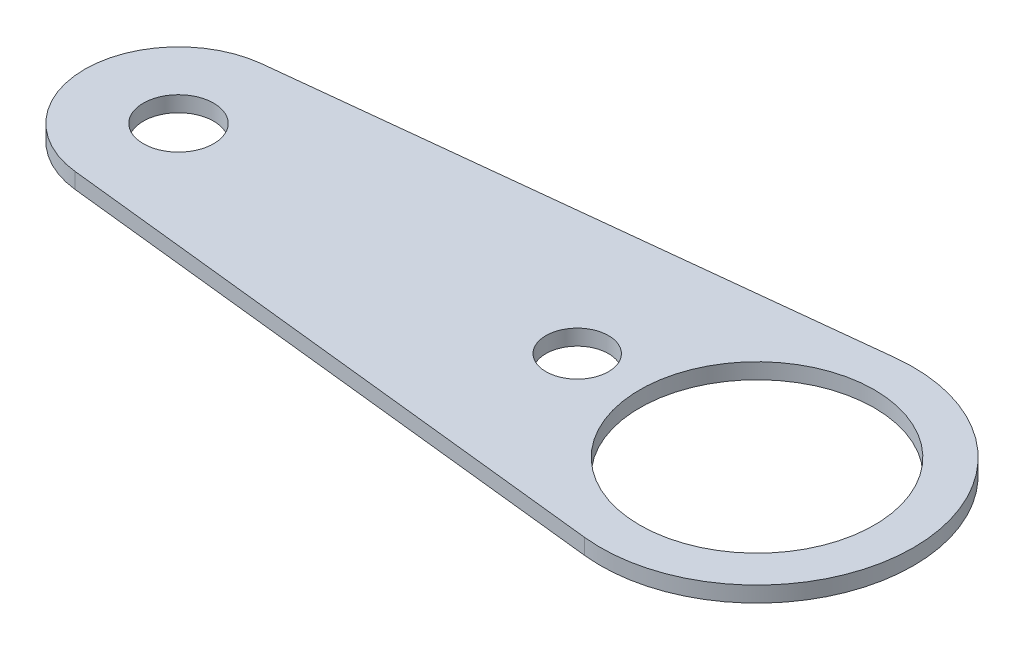
ISO-10303-21;
HEADER;
FILE_DESCRIPTION(('STEP AP214'),'2;1');
FILE_NAME('part.step','',(''),(''),'','','');
FILE_SCHEMA(('AUTOMOTIVE_DESIGN { 1 0 10303 214 1 1 1 1 }'));
ENDSEC;
DATA;
#1=APPLICATION_CONTEXT('core data for automotive mechanical design processes');
#2=APPLICATION_PROTOCOL_DEFINITION('international standard','automotive_design',2000,#1);
#3=PRODUCT_CONTEXT('',#1,'mechanical');
#4=PRODUCT('Part','Part','',(#3));
#5=PRODUCT_RELATED_PRODUCT_CATEGORY('part','',(#4));
#6=PRODUCT_DEFINITION_FORMATION('','',#4);
#7=PRODUCT_DEFINITION_CONTEXT('part definition',#1,'design');
#8=PRODUCT_DEFINITION('design','',#6,#7);
#9=PRODUCT_DEFINITION_SHAPE('','',#8);
#10=(LENGTH_UNIT() NAMED_UNIT(*) SI_UNIT(.MILLI.,.METRE.));
#11=(NAMED_UNIT(*) PLANE_ANGLE_UNIT() SI_UNIT($,.RADIAN.));
#12=(NAMED_UNIT(*) SI_UNIT($,.STERADIAN.) SOLID_ANGLE_UNIT());
#13=UNCERTAINTY_MEASURE_WITH_UNIT(LENGTH_MEASURE(1.E-05),#10,'distance_accuracy_value','');
#14=(GEOMETRIC_REPRESENTATION_CONTEXT(3) GLOBAL_UNCERTAINTY_ASSIGNED_CONTEXT((#13)) GLOBAL_UNIT_ASSIGNED_CONTEXT((#10,
#11,#12)) REPRESENTATION_CONTEXT('',''));
#15=CARTESIAN_POINT('',(0.,0.,0.));
#16=DIRECTION('',(0.,0.,1.));
#17=DIRECTION('',(1.,0.,0.));
#18=AXIS2_PLACEMENT_3D('',#15,#16,#17);
#19=CARTESIAN_POINT('',(0.,1.,0.));
#20=DIRECTION('',(0.,1.,0.));
#21=DIRECTION('',(0.,0.,1.));
#22=AXIS2_PLACEMENT_3D('',#19,#20,#21);
#23=PLANE('',#22);
#24=CARTESIAN_POINT('',(0.,1.,0.));
#25=DIRECTION('',(0.,1.,0.));
#26=DIRECTION('',(0.,0.,1.));
#27=AXIS2_PLACEMENT_3D('',#24,#25,#26);
#28=CIRCLE('',#27,7.5);
#29=CARTESIAN_POINT('',(0.,1.,7.5));
#30=VERTEX_POINT('',#29);
#31=EDGE_CURVE('E114',#30,#30,#28,.T.);
#32=ORIENTED_EDGE('',*,*,#31,.F.);
#33=EDGE_LOOP('',(#32));
#34=FACE_BOUND('',#33,.T.);
#35=CARTESIAN_POINT('',(0.,1.,0.));
#36=DIRECTION('',(0.,1.,0.));
#37=DIRECTION('',(0.,0.,1.));
#38=AXIS2_PLACEMENT_3D('',#35,#36,#37);
#39=CIRCLE('',#38,10.);
#40=CARTESIAN_POINT('',(-1.08108108108108,1.,9.94139143662136));
#41=VERTEX_POINT('',#40);
#42=CARTESIAN_POINT('',(-1.08108108108108,1.,-9.94139143662136));
#43=VERTEX_POINT('',#42);
#44=EDGE_CURVE('E84',#41,#43,#39,.T.);
#45=ORIENTED_EDGE('',*,*,#44,.T.);
#46=DIRECTION('',(-0.994139143662136,0.,0.108108108108108));
#47=VECTOR('',#46,1.);
#48=CARTESIAN_POINT('',(-1.08108108108108,1.,-9.94139143662136));
#49=LINE('',#48,#47);
#50=CARTESIAN_POINT('',(-37.6486486486486,1.,-5.96483486197282));
#51=VERTEX_POINT('',#50);
#52=EDGE_CURVE('E79',#43,#51,#49,.T.);
#53=ORIENTED_EDGE('',*,*,#52,.T.);
#54=CARTESIAN_POINT('',(-37.,1.,0.));
#55=DIRECTION('',(0.,1.,0.));
#56=DIRECTION('',(0.,0.,1.));
#57=AXIS2_PLACEMENT_3D('',#54,#55,#56);
#58=CIRCLE('',#57,6.);
#59=CARTESIAN_POINT('',(-37.6486486486486,1.,5.96483486197282));
#60=VERTEX_POINT('',#59);
#61=EDGE_CURVE('E82',#51,#60,#58,.T.);
#62=ORIENTED_EDGE('',*,*,#61,.T.);
#63=DIRECTION('',(0.994139143662136,0.,0.108108108108108));
#64=VECTOR('',#63,1.);
#65=CARTESIAN_POINT('',(-1.08108108108108,1.,9.94139143662136));
#66=LINE('',#65,#64);
#67=EDGE_CURVE('E49',#60,#41,#66,.T.);
#68=ORIENTED_EDGE('',*,*,#67,.T.);
#69=EDGE_LOOP('',(#45,#53,#62,#68));
#70=FACE_BOUND('',#69,.T.);
#71=CARTESIAN_POINT('',(-37.,1.,0.));
#72=DIRECTION('',(0.,1.,0.));
#73=DIRECTION('',(0.,0.,1.));
#74=AXIS2_PLACEMENT_3D('',#71,#72,#73);
#75=CIRCLE('',#74,2.25);
#76=CARTESIAN_POINT('',(-37.,1.,2.25));
#77=VERTEX_POINT('',#76);
#78=EDGE_CURVE('E99',#77,#77,#75,.T.);
#79=ORIENTED_EDGE('',*,*,#78,.F.);
#80=EDGE_LOOP('',(#79));
#81=FACE_BOUND('',#80,.T.);
#82=CARTESIAN_POINT('',(-11.5,1.,0.));
#83=DIRECTION('',(0.,1.,0.));
#84=DIRECTION('',(0.,0.,1.));
#85=AXIS2_PLACEMENT_3D('',#82,#83,#84);
#86=CIRCLE('',#85,2.);
#87=CARTESIAN_POINT('',(-11.5,1.,2.));
#88=VERTEX_POINT('',#87);
#89=EDGE_CURVE('E120',#88,#88,#86,.T.);
#90=ORIENTED_EDGE('',*,*,#89,.F.);
#91=EDGE_LOOP('',(#90));
#92=FACE_BOUND('',#91,.T.);
#93=ADVANCED_FACE('F32',(#34,#70,#81,#92),#23,.T.);
#94=CARTESIAN_POINT('',(0.,0.,0.));
#95=DIRECTION('',(0.,1.,0.));
#96=DIRECTION('',(0.,0.,1.));
#97=AXIS2_PLACEMENT_3D('',#94,#95,#96);
#98=PLANE('',#97);
#99=CARTESIAN_POINT('',(0.,0.,0.));
#100=DIRECTION('',(0.,1.,0.));
#101=DIRECTION('',(0.,0.,1.));
#102=AXIS2_PLACEMENT_3D('',#99,#100,#101);
#103=CIRCLE('',#102,10.);
#104=CARTESIAN_POINT('',(-1.08108108108108,0.,9.94139143662136));
#105=VERTEX_POINT('',#104);
#106=CARTESIAN_POINT('',(-1.08108108108108,0.,-9.94139143662136));
#107=VERTEX_POINT('',#106);
#108=EDGE_CURVE('E96',#105,#107,#103,.T.);
#109=ORIENTED_EDGE('',*,*,#108,.F.);
#110=DIRECTION('',(0.994139143662136,0.,0.108108108108108));
#111=VECTOR('',#110,1.);
#112=CARTESIAN_POINT('',(-1.08108108108108,0.,9.94139143662136));
#113=LINE('',#112,#111);
#114=CARTESIAN_POINT('',(-37.6486486486486,0.,5.96483486197282));
#115=VERTEX_POINT('',#114);
#116=EDGE_CURVE('E72',#115,#105,#113,.T.);
#117=ORIENTED_EDGE('',*,*,#116,.F.);
#118=CARTESIAN_POINT('',(-37.,0.,0.));
#119=DIRECTION('',(0.,1.,0.));
#120=DIRECTION('',(0.,0.,1.));
#121=AXIS2_PLACEMENT_3D('',#118,#119,#120);
#122=CIRCLE('',#121,6.);
#123=CARTESIAN_POINT('',(-37.6486486486486,0.,-5.96483486197282));
#124=VERTEX_POINT('',#123);
#125=EDGE_CURVE('E66',#124,#115,#122,.T.);
#126=ORIENTED_EDGE('',*,*,#125,.F.);
#127=DIRECTION('',(-0.994139143662136,0.,0.108108108108108));
#128=VECTOR('',#127,1.);
#129=CARTESIAN_POINT('',(-1.08108108108108,0.,-9.94139143662136));
#130=LINE('',#129,#128);
#131=EDGE_CURVE('E88',#107,#124,#130,.T.);
#132=ORIENTED_EDGE('',*,*,#131,.F.);
#133=EDGE_LOOP('',(#109,#117,#126,#132));
#134=FACE_BOUND('',#133,.T.);
#135=CARTESIAN_POINT('',(-37.,0.,0.));
#136=DIRECTION('',(0.,1.,0.));
#137=DIRECTION('',(0.,0.,1.));
#138=AXIS2_PLACEMENT_3D('',#135,#136,#137);
#139=CIRCLE('',#138,2.25);
#140=CARTESIAN_POINT('',(-37.,0.,2.25));
#141=VERTEX_POINT('',#140);
#142=EDGE_CURVE('E111',#141,#141,#139,.T.);
#143=ORIENTED_EDGE('',*,*,#142,.T.);
#144=EDGE_LOOP('',(#143));
#145=FACE_BOUND('',#144,.T.);
#146=CARTESIAN_POINT('',(0.,0.,0.));
#147=DIRECTION('',(0.,1.,0.));
#148=DIRECTION('',(0.,0.,1.));
#149=AXIS2_PLACEMENT_3D('',#146,#147,#148);
#150=CIRCLE('',#149,7.5);
#151=CARTESIAN_POINT('',(0.,0.,7.5));
#152=VERTEX_POINT('',#151);
#153=EDGE_CURVE('E117',#152,#152,#150,.T.);
#154=ORIENTED_EDGE('',*,*,#153,.T.);
#155=EDGE_LOOP('',(#154));
#156=FACE_BOUND('',#155,.T.);
#157=CARTESIAN_POINT('',(-11.5,0.,0.));
#158=DIRECTION('',(0.,1.,0.));
#159=DIRECTION('',(0.,0.,1.));
#160=AXIS2_PLACEMENT_3D('',#157,#158,#159);
#161=CIRCLE('',#160,2.);
#162=CARTESIAN_POINT('',(-11.5,0.,2.));
#163=VERTEX_POINT('',#162);
#164=EDGE_CURVE('E123',#163,#163,#161,.T.);
#165=ORIENTED_EDGE('',*,*,#164,.T.);
#166=EDGE_LOOP('',(#165));
#167=FACE_BOUND('',#166,.T.);
#168=ADVANCED_FACE('F107',(#134,#145,#156,#167),#98,.F.);
#169=CARTESIAN_POINT('',(0.,1.,0.));
#170=DIRECTION('',(0.,-1.,0.));
#171=DIRECTION('',(0.,0.,-1.));
#172=AXIS2_PLACEMENT_3D('',#169,#170,#171);
#173=CYLINDRICAL_SURFACE('',#172,10.);
#174=ORIENTED_EDGE('',*,*,#108,.T.);
#175=DIRECTION('',(0.,-1.,0.));
#176=VECTOR('',#175,1.);
#177=CARTESIAN_POINT('',(-1.08108108108108,1.,-9.94139143662136));
#178=LINE('',#177,#176);
#179=EDGE_CURVE('E11',#43,#107,#178,.T.);
#180=ORIENTED_EDGE('',*,*,#179,.F.);
#181=ORIENTED_EDGE('',*,*,#44,.F.);
#182=DIRECTION('',(0.,-1.,0.));
#183=VECTOR('',#182,1.);
#184=CARTESIAN_POINT('',(-1.08108108108108,1.,9.94139143662136));
#185=LINE('',#184,#183);
#186=EDGE_CURVE('E92',#41,#105,#185,.T.);
#187=ORIENTED_EDGE('',*,*,#186,.T.);
#188=EDGE_LOOP('',(#174,#180,#181,#187));
#189=FACE_BOUND('',#188,.T.);
#190=ADVANCED_FACE('F34',(#189),#173,.T.);
#191=CARTESIAN_POINT('',(-1.08108108108108,1.,-9.94139143662136));
#192=DIRECTION('',(0.108108108108108,0.,0.994139143662136));
#193=DIRECTION('',(0.994139143662136,0.,-0.108108108108108));
#194=AXIS2_PLACEMENT_3D('',#191,#192,#193);
#195=PLANE('',#194);
#196=ORIENTED_EDGE('',*,*,#131,.T.);
#197=DIRECTION('',(0.,-1.,0.));
#198=VECTOR('',#197,1.);
#199=CARTESIAN_POINT('',(-37.6486486486486,1.,-5.96483486197282));
#200=LINE('',#199,#198);
#201=EDGE_CURVE('E41',#51,#124,#200,.T.);
#202=ORIENTED_EDGE('',*,*,#201,.F.);
#203=ORIENTED_EDGE('',*,*,#52,.F.);
#204=ORIENTED_EDGE('',*,*,#179,.T.);
#205=EDGE_LOOP('',(#196,#202,#203,#204));
#206=FACE_BOUND('',#205,.T.);
#207=ADVANCED_FACE('F87',(#206),#195,.F.);
#208=CARTESIAN_POINT('',(-37.,1.,0.));
#209=DIRECTION('',(0.,-1.,0.));
#210=DIRECTION('',(0.,0.,-1.));
#211=AXIS2_PLACEMENT_3D('',#208,#209,#210);
#212=CYLINDRICAL_SURFACE('',#211,6.);
#213=ORIENTED_EDGE('',*,*,#125,.T.);
#214=DIRECTION('',(0.,-1.,0.));
#215=VECTOR('',#214,1.);
#216=CARTESIAN_POINT('',(-37.6486486486486,1.,5.96483486197282));
#217=LINE('',#216,#215);
#218=EDGE_CURVE('E89',#60,#115,#217,.T.);
#219=ORIENTED_EDGE('',*,*,#218,.F.);
#220=ORIENTED_EDGE('',*,*,#61,.F.);
#221=ORIENTED_EDGE('',*,*,#201,.T.);
#222=EDGE_LOOP('',(#213,#219,#220,#221));
#223=FACE_BOUND('',#222,.T.);
#224=ADVANCED_FACE('F90',(#223),#212,.T.);
#225=CARTESIAN_POINT('',(-1.08108108108108,1.,9.94139143662136));
#226=DIRECTION('',(0.108108108108108,0.,-0.994139143662136));
#227=DIRECTION('',(-0.994139143662136,0.,-0.108108108108108));
#228=AXIS2_PLACEMENT_3D('',#225,#226,#227);
#229=PLANE('',#228);
#230=ORIENTED_EDGE('',*,*,#116,.T.);
#231=ORIENTED_EDGE('',*,*,#186,.F.);
#232=ORIENTED_EDGE('',*,*,#67,.F.);
#233=ORIENTED_EDGE('',*,*,#218,.T.);
#234=EDGE_LOOP('',(#230,#231,#232,#233));
#235=FACE_BOUND('',#234,.T.);
#236=ADVANCED_FACE('F104',(#235),#229,.F.);
#237=CARTESIAN_POINT('',(-37.,1.,0.));
#238=DIRECTION('',(0.,-1.,0.));
#239=DIRECTION('',(0.,0.,-1.));
#240=AXIS2_PLACEMENT_3D('',#237,#238,#239);
#241=CYLINDRICAL_SURFACE('',#240,2.25);
#242=ORIENTED_EDGE('',*,*,#78,.T.);
#243=EDGE_LOOP('',(#242));
#244=FACE_BOUND('',#243,.T.);
#245=ORIENTED_EDGE('',*,*,#142,.F.);
#246=EDGE_LOOP('',(#245));
#247=FACE_BOUND('',#246,.T.);
#248=ADVANCED_FACE('F141',(#244,#247),#241,.F.);
#249=CARTESIAN_POINT('',(0.,1.,0.));
#250=DIRECTION('',(0.,-1.,0.));
#251=DIRECTION('',(0.,0.,-1.));
#252=AXIS2_PLACEMENT_3D('',#249,#250,#251);
#253=CYLINDRICAL_SURFACE('',#252,7.5);
#254=ORIENTED_EDGE('',*,*,#31,.T.);
#255=EDGE_LOOP('',(#254));
#256=FACE_BOUND('',#255,.T.);
#257=ORIENTED_EDGE('',*,*,#153,.F.);
#258=EDGE_LOOP('',(#257));
#259=FACE_BOUND('',#258,.T.);
#260=ADVANCED_FACE('F187',(#256,#259),#253,.F.);
#261=CARTESIAN_POINT('',(-11.5,1.,0.));
#262=DIRECTION('',(0.,-1.,0.));
#263=DIRECTION('',(0.,0.,-1.));
#264=AXIS2_PLACEMENT_3D('',#261,#262,#263);
#265=CYLINDRICAL_SURFACE('',#264,2.);
#266=ORIENTED_EDGE('',*,*,#89,.T.);
#267=EDGE_LOOP('',(#266));
#268=FACE_BOUND('',#267,.T.);
#269=ORIENTED_EDGE('',*,*,#164,.F.);
#270=EDGE_LOOP('',(#269));
#271=FACE_BOUND('',#270,.T.);
#272=ADVANCED_FACE('F129',(#268,#271),#265,.F.);
#273=CLOSED_SHELL('',(#93,#168,#190,#207,#224,#236,#248,#260,#272));
#274=MANIFOLD_SOLID_BREP('B2',#273);
#275=ADVANCED_BREP_SHAPE_REPRESENTATION('',(#18,#274),#14);
#276=SHAPE_DEFINITION_REPRESENTATION(#9,#275);
ENDSEC;
END-ISO-10303-21;
